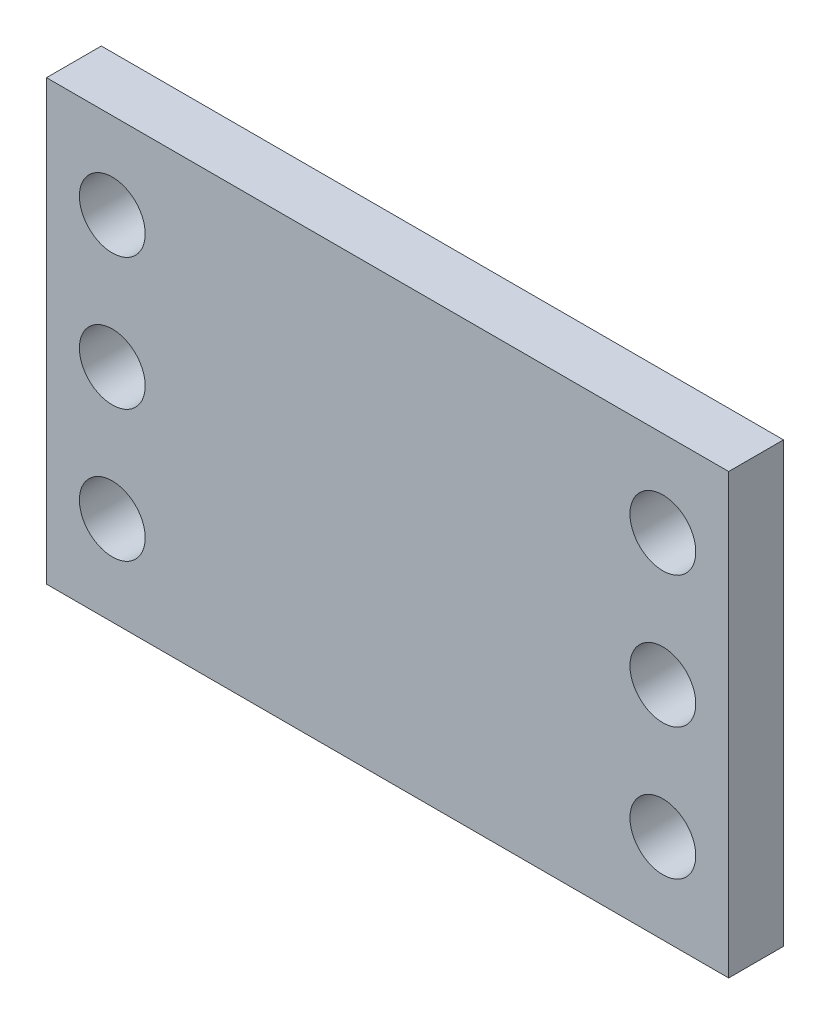
ISO-10303-21;
HEADER;
FILE_DESCRIPTION(('STEP AP214'),'2;1');
FILE_NAME('part.step','',(''),(''),'','','');
FILE_SCHEMA(('AUTOMOTIVE_DESIGN { 1 0 10303 214 1 1 1 1 }'));
ENDSEC;
DATA;
#1=APPLICATION_CONTEXT('core data for automotive mechanical design processes');
#2=APPLICATION_PROTOCOL_DEFINITION('international standard','automotive_design',2000,#1);
#3=PRODUCT_CONTEXT('',#1,'mechanical');
#4=PRODUCT('Part','Part','',(#3));
#5=PRODUCT_RELATED_PRODUCT_CATEGORY('part','',(#4));
#6=PRODUCT_DEFINITION_FORMATION('','',#4);
#7=PRODUCT_DEFINITION_CONTEXT('part definition',#1,'design');
#8=PRODUCT_DEFINITION('design','',#6,#7);
#9=PRODUCT_DEFINITION_SHAPE('','',#8);
#10=(LENGTH_UNIT() NAMED_UNIT(*) SI_UNIT(.MILLI.,.METRE.));
#11=(NAMED_UNIT(*) PLANE_ANGLE_UNIT() SI_UNIT($,.RADIAN.));
#12=(NAMED_UNIT(*) SI_UNIT($,.STERADIAN.) SOLID_ANGLE_UNIT());
#13=UNCERTAINTY_MEASURE_WITH_UNIT(LENGTH_MEASURE(1.E-05),#10,'distance_accuracy_value','');
#14=(GEOMETRIC_REPRESENTATION_CONTEXT(3) GLOBAL_UNCERTAINTY_ASSIGNED_CONTEXT((#13)) GLOBAL_UNIT_ASSIGNED_CONTEXT((#10,
#11,#12)) REPRESENTATION_CONTEXT('',''));
#15=CARTESIAN_POINT('',(0.,0.,0.));
#16=DIRECTION('',(0.,0.,1.));
#17=DIRECTION('',(1.,0.,0.));
#18=AXIS2_PLACEMENT_3D('',#15,#16,#17);
#19=CARTESIAN_POINT('',(37.9751232305072,19.2400028253771,5.));
#20=DIRECTION('',(1.,0.,0.));
#21=DIRECTION('',(0.,0.,-1.));
#22=AXIS2_PLACEMENT_3D('',#19,#20,#21);
#23=PLANE('',#22);
#24=DIRECTION('',(0.,-1.,0.));
#25=VECTOR('',#24,1.);
#26=CARTESIAN_POINT('',(37.9751232305072,19.2400028253771,0.));
#27=LINE('',#26,#25);
#28=CARTESIAN_POINT('',(37.9751232305072,59.2400028253771,0.));
#29=VERTEX_POINT('',#28);
#30=CARTESIAN_POINT('',(37.9751232305072,19.2400028253771,0.));
#31=VERTEX_POINT('',#30);
#32=EDGE_CURVE('E101',#29,#31,#27,.T.);
#33=ORIENTED_EDGE('',*,*,#32,.T.);
#34=DIRECTION('',(0.,0.,-1.));
#35=VECTOR('',#34,1.);
#36=CARTESIAN_POINT('',(37.9751232305072,19.2400028253771,5.));
#37=LINE('',#36,#35);
#38=CARTESIAN_POINT('',(37.9751232305072,19.2400028253771,5.));
#39=VERTEX_POINT('',#38);
#40=EDGE_CURVE('E11',#39,#31,#37,.T.);
#41=ORIENTED_EDGE('',*,*,#40,.F.);
#42=DIRECTION('',(0.,-1.,0.));
#43=VECTOR('',#42,1.);
#44=CARTESIAN_POINT('',(37.9751232305072,19.2400028253771,5.));
#45=LINE('',#44,#43);
#46=CARTESIAN_POINT('',(37.9751232305072,59.2400028253771,5.));
#47=VERTEX_POINT('',#46);
#48=EDGE_CURVE('E89',#47,#39,#45,.T.);
#49=ORIENTED_EDGE('',*,*,#48,.F.);
#50=DIRECTION('',(0.,0.,-1.));
#51=VECTOR('',#50,1.);
#52=CARTESIAN_POINT('',(37.9751232305072,59.2400028253771,5.));
#53=LINE('',#52,#51);
#54=EDGE_CURVE('E97',#47,#29,#53,.T.);
#55=ORIENTED_EDGE('',*,*,#54,.T.);
#56=EDGE_LOOP('',(#33,#41,#49,#55));
#57=FACE_BOUND('',#56,.T.);
#58=ADVANCED_FACE('F38',(#57),#23,.F.);
#59=CARTESIAN_POINT('',(37.9751232305072,19.2400028253771,5.));
#60=DIRECTION('',(0.,1.,0.));
#61=DIRECTION('',(0.,0.,1.));
#62=AXIS2_PLACEMENT_3D('',#59,#60,#61);
#63=PLANE('',#62);
#64=DIRECTION('',(1.,0.,0.));
#65=VECTOR('',#64,1.);
#66=CARTESIAN_POINT('',(37.9751232305072,19.2400028253771,0.));
#67=LINE('',#66,#65);
#68=CARTESIAN_POINT('',(100.181496793345,19.2400028253771,0.));
#69=VERTEX_POINT('',#68);
#70=EDGE_CURVE('E93',#31,#69,#67,.T.);
#71=ORIENTED_EDGE('',*,*,#70,.T.);
#72=DIRECTION('',(0.,0.,-1.));
#73=VECTOR('',#72,1.);
#74=CARTESIAN_POINT('',(100.181496793345,19.2400028253771,5.));
#75=LINE('',#74,#73);
#76=CARTESIAN_POINT('',(100.181496793345,19.2400028253771,5.));
#77=VERTEX_POINT('',#76);
#78=EDGE_CURVE('E46',#77,#69,#75,.T.);
#79=ORIENTED_EDGE('',*,*,#78,.F.);
#80=DIRECTION('',(1.,0.,0.));
#81=VECTOR('',#80,1.);
#82=CARTESIAN_POINT('',(37.9751232305072,19.2400028253771,5.));
#83=LINE('',#82,#81);
#84=EDGE_CURVE('E84',#39,#77,#83,.T.);
#85=ORIENTED_EDGE('',*,*,#84,.F.);
#86=ORIENTED_EDGE('',*,*,#40,.T.);
#87=EDGE_LOOP('',(#71,#79,#85,#86));
#88=FACE_BOUND('',#87,.T.);
#89=ADVANCED_FACE('F92',(#88),#63,.F.);
#90=CARTESIAN_POINT('',(100.181496793345,19.2400028253771,5.));
#91=DIRECTION('',(-1.,0.,0.));
#92=DIRECTION('',(0.,0.,1.));
#93=AXIS2_PLACEMENT_3D('',#90,#91,#92);
#94=PLANE('',#93);
#95=DIRECTION('',(0.,1.,0.));
#96=VECTOR('',#95,1.);
#97=CARTESIAN_POINT('',(100.181496793345,19.2400028253771,0.));
#98=LINE('',#97,#96);
#99=CARTESIAN_POINT('',(100.181496793345,59.2400028253771,0.));
#100=VERTEX_POINT('',#99);
#101=EDGE_CURVE('E71',#69,#100,#98,.T.);
#102=ORIENTED_EDGE('',*,*,#101,.T.);
#103=DIRECTION('',(0.,0.,-1.));
#104=VECTOR('',#103,1.);
#105=CARTESIAN_POINT('',(100.181496793345,59.2400028253771,5.));
#106=LINE('',#105,#104);
#107=CARTESIAN_POINT('',(100.181496793345,59.2400028253771,5.));
#108=VERTEX_POINT('',#107);
#109=EDGE_CURVE('E94',#108,#100,#106,.T.);
#110=ORIENTED_EDGE('',*,*,#109,.F.);
#111=DIRECTION('',(0.,1.,0.));
#112=VECTOR('',#111,1.);
#113=CARTESIAN_POINT('',(100.181496793345,19.2400028253771,5.));
#114=LINE('',#113,#112);
#115=EDGE_CURVE('E87',#77,#108,#114,.T.);
#116=ORIENTED_EDGE('',*,*,#115,.F.);
#117=ORIENTED_EDGE('',*,*,#78,.T.);
#118=EDGE_LOOP('',(#102,#110,#116,#117));
#119=FACE_BOUND('',#118,.T.);
#120=ADVANCED_FACE('F95',(#119),#94,.F.);
#121=CARTESIAN_POINT('',(37.9751232305072,59.2400028253771,5.));
#122=DIRECTION('',(0.,-1.,0.));
#123=DIRECTION('',(0.,0.,-1.));
#124=AXIS2_PLACEMENT_3D('',#121,#122,#123);
#125=PLANE('',#124);
#126=DIRECTION('',(-1.,0.,0.));
#127=VECTOR('',#126,1.);
#128=CARTESIAN_POINT('',(37.9751232305072,59.2400028253771,0.));
#129=LINE('',#128,#127);
#130=EDGE_CURVE('E77',#100,#29,#129,.T.);
#131=ORIENTED_EDGE('',*,*,#130,.T.);
#132=ORIENTED_EDGE('',*,*,#54,.F.);
#133=DIRECTION('',(-1.,0.,0.));
#134=VECTOR('',#133,1.);
#135=CARTESIAN_POINT('',(37.9751232305072,59.2400028253771,5.));
#136=LINE('',#135,#134);
#137=EDGE_CURVE('E54',#108,#47,#136,.T.);
#138=ORIENTED_EDGE('',*,*,#137,.F.);
#139=ORIENTED_EDGE('',*,*,#109,.T.);
#140=EDGE_LOOP('',(#131,#132,#138,#139));
#141=FACE_BOUND('',#140,.T.);
#142=ADVANCED_FACE('F109',(#141),#125,.F.);
#143=CARTESIAN_POINT('',(0.,0.,5.));
#144=DIRECTION('',(0.,0.,-1.));
#145=DIRECTION('',(-1.,0.,0.));
#146=AXIS2_PLACEMENT_3D('',#143,#144,#145);
#147=PLANE('',#146);
#148=CARTESIAN_POINT('',(94.1814967933452,39.3944343600588,5.));
#149=DIRECTION('',(0.,0.,-1.));
#150=DIRECTION('',(-1.,0.,0.));
#151=AXIS2_PLACEMENT_3D('',#148,#149,#150);
#152=CIRCLE('',#151,3.00000000000001);
#153=CARTESIAN_POINT('',(91.1814967933452,39.3944343600588,5.));
#154=VERTEX_POINT('',#153);
#155=EDGE_CURVE('E104',#154,#154,#152,.T.);
#156=ORIENTED_EDGE('',*,*,#155,.T.);
#157=EDGE_LOOP('',(#156));
#158=FACE_BOUND('',#157,.T.);
#159=CARTESIAN_POINT('',(94.1814967933452,51.3944343600588,5.));
#160=DIRECTION('',(0.,0.,-1.));
#161=DIRECTION('',(-1.,0.,0.));
#162=AXIS2_PLACEMENT_3D('',#159,#160,#161);
#163=CIRCLE('',#162,3.00000000000001);
#164=CARTESIAN_POINT('',(91.1814967933452,51.3944343600588,5.));
#165=VERTEX_POINT('',#164);
#166=EDGE_CURVE('E117',#165,#165,#163,.T.);
#167=ORIENTED_EDGE('',*,*,#166,.T.);
#168=EDGE_LOOP('',(#167));
#169=FACE_BOUND('',#168,.T.);
#170=CARTESIAN_POINT('',(43.975123230507,27.3944343600588,5.));
#171=DIRECTION('',(0.,0.,-1.));
#172=DIRECTION('',(-1.,0.,0.));
#173=AXIS2_PLACEMENT_3D('',#170,#171,#172);
#174=CIRCLE('',#173,3.);
#175=CARTESIAN_POINT('',(40.975123230507,27.3944343600588,5.));
#176=VERTEX_POINT('',#175);
#177=EDGE_CURVE('E120',#176,#176,#174,.T.);
#178=ORIENTED_EDGE('',*,*,#177,.T.);
#179=EDGE_LOOP('',(#178));
#180=FACE_BOUND('',#179,.T.);
#181=CARTESIAN_POINT('',(43.975123230507,39.3944343600588,5.));
#182=DIRECTION('',(0.,0.,-1.));
#183=DIRECTION('',(-1.,0.,0.));
#184=AXIS2_PLACEMENT_3D('',#181,#182,#183);
#185=CIRCLE('',#184,3.);
#186=CARTESIAN_POINT('',(40.975123230507,39.3944343600588,5.));
#187=VERTEX_POINT('',#186);
#188=EDGE_CURVE('E123',#187,#187,#185,.T.);
#189=ORIENTED_EDGE('',*,*,#188,.T.);
#190=EDGE_LOOP('',(#189));
#191=FACE_BOUND('',#190,.T.);
#192=CARTESIAN_POINT('',(43.975123230507,51.3944343600588,5.));
#193=DIRECTION('',(0.,0.,-1.));
#194=DIRECTION('',(-1.,0.,0.));
#195=AXIS2_PLACEMENT_3D('',#192,#193,#194);
#196=CIRCLE('',#195,3.);
#197=CARTESIAN_POINT('',(40.975123230507,51.3944343600588,5.));
#198=VERTEX_POINT('',#197);
#199=EDGE_CURVE('E126',#198,#198,#196,.T.);
#200=ORIENTED_EDGE('',*,*,#199,.T.);
#201=EDGE_LOOP('',(#200));
#202=FACE_BOUND('',#201,.T.);
#203=CARTESIAN_POINT('',(94.1814967933452,27.3944343600588,5.));
#204=DIRECTION('',(0.,0.,-1.));
#205=DIRECTION('',(-1.,0.,0.));
#206=AXIS2_PLACEMENT_3D('',#203,#204,#205);
#207=CIRCLE('',#206,2.99999999999999);
#208=CARTESIAN_POINT('',(91.1814967933452,27.3944343600588,5.));
#209=VERTEX_POINT('',#208);
#210=EDGE_CURVE('E129',#209,#209,#207,.T.);
#211=ORIENTED_EDGE('',*,*,#210,.T.);
#212=EDGE_LOOP('',(#211));
#213=FACE_BOUND('',#212,.T.);
#214=ORIENTED_EDGE('',*,*,#48,.T.);
#215=ORIENTED_EDGE('',*,*,#84,.T.);
#216=ORIENTED_EDGE('',*,*,#115,.T.);
#217=ORIENTED_EDGE('',*,*,#137,.T.);
#218=EDGE_LOOP('',(#214,#215,#216,#217));
#219=FACE_BOUND('',#218,.T.);
#220=ADVANCED_FACE('F85',(#158,#169,#180,#191,#202,#213,#219),#147,.F.);
#221=CARTESIAN_POINT('',(0.,0.,0.));
#222=DIRECTION('',(0.,0.,-1.));
#223=DIRECTION('',(-1.,0.,0.));
#224=AXIS2_PLACEMENT_3D('',#221,#222,#223);
#225=PLANE('',#224);
#226=CARTESIAN_POINT('',(94.1814967933452,39.3944343600588,0.));
#227=DIRECTION('',(0.,0.,-1.));
#228=DIRECTION('',(-1.,0.,0.));
#229=AXIS2_PLACEMENT_3D('',#226,#227,#228);
#230=CIRCLE('',#229,3.00000000000001);
#231=CARTESIAN_POINT('',(91.1814967933452,39.3944343600588,0.));
#232=VERTEX_POINT('',#231);
#233=EDGE_CURVE('E135',#232,#232,#230,.T.);
#234=ORIENTED_EDGE('',*,*,#233,.F.);
#235=EDGE_LOOP('',(#234));
#236=FACE_BOUND('',#235,.T.);
#237=CARTESIAN_POINT('',(94.1814967933452,51.3944343600588,0.));
#238=DIRECTION('',(0.,0.,-1.));
#239=DIRECTION('',(-1.,0.,0.));
#240=AXIS2_PLACEMENT_3D('',#237,#238,#239);
#241=CIRCLE('',#240,3.00000000000001);
#242=CARTESIAN_POINT('',(91.1814967933452,51.3944343600588,0.));
#243=VERTEX_POINT('',#242);
#244=EDGE_CURVE('E143',#243,#243,#241,.T.);
#245=ORIENTED_EDGE('',*,*,#244,.F.);
#246=EDGE_LOOP('',(#245));
#247=FACE_BOUND('',#246,.T.);
#248=CARTESIAN_POINT('',(43.975123230507,27.3944343600588,0.));
#249=DIRECTION('',(0.,0.,-1.));
#250=DIRECTION('',(-1.,0.,0.));
#251=AXIS2_PLACEMENT_3D('',#248,#249,#250);
#252=CIRCLE('',#251,3.);
#253=CARTESIAN_POINT('',(40.975123230507,27.3944343600588,0.));
#254=VERTEX_POINT('',#253);
#255=EDGE_CURVE('E139',#254,#254,#252,.T.);
#256=ORIENTED_EDGE('',*,*,#255,.F.);
#257=EDGE_LOOP('',(#256));
#258=FACE_BOUND('',#257,.T.);
#259=CARTESIAN_POINT('',(43.975123230507,39.3944343600588,0.));
#260=DIRECTION('',(0.,0.,-1.));
#261=DIRECTION('',(-1.,0.,0.));
#262=AXIS2_PLACEMENT_3D('',#259,#260,#261);
#263=CIRCLE('',#262,3.);
#264=CARTESIAN_POINT('',(40.975123230507,39.3944343600588,0.));
#265=VERTEX_POINT('',#264);
#266=EDGE_CURVE('E136',#265,#265,#263,.T.);
#267=ORIENTED_EDGE('',*,*,#266,.F.);
#268=EDGE_LOOP('',(#267));
#269=FACE_BOUND('',#268,.T.);
#270=CARTESIAN_POINT('',(43.975123230507,51.3944343600588,0.));
#271=DIRECTION('',(0.,0.,-1.));
#272=DIRECTION('',(-1.,0.,0.));
#273=AXIS2_PLACEMENT_3D('',#270,#271,#272);
#274=CIRCLE('',#273,3.);
#275=CARTESIAN_POINT('',(40.975123230507,51.3944343600588,0.));
#276=VERTEX_POINT('',#275);
#277=EDGE_CURVE('E140',#276,#276,#274,.T.);
#278=ORIENTED_EDGE('',*,*,#277,.F.);
#279=EDGE_LOOP('',(#278));
#280=FACE_BOUND('',#279,.T.);
#281=CARTESIAN_POINT('',(94.1814967933452,27.3944343600588,0.));
#282=DIRECTION('',(0.,0.,-1.));
#283=DIRECTION('',(-1.,0.,0.));
#284=AXIS2_PLACEMENT_3D('',#281,#282,#283);
#285=CIRCLE('',#284,2.99999999999999);
#286=CARTESIAN_POINT('',(91.1814967933452,27.3944343600588,0.));
#287=VERTEX_POINT('',#286);
#288=EDGE_CURVE('E132',#287,#287,#285,.T.);
#289=ORIENTED_EDGE('',*,*,#288,.F.);
#290=EDGE_LOOP('',(#289));
#291=FACE_BOUND('',#290,.T.);
#292=ORIENTED_EDGE('',*,*,#32,.F.);
#293=ORIENTED_EDGE('',*,*,#130,.F.);
#294=ORIENTED_EDGE('',*,*,#101,.F.);
#295=ORIENTED_EDGE('',*,*,#70,.F.);
#296=EDGE_LOOP('',(#292,#293,#294,#295));
#297=FACE_BOUND('',#296,.T.);
#298=ADVANCED_FACE('F112',(#236,#247,#258,#269,#280,#291,#297),#225,.T.);
#299=CARTESIAN_POINT('',(94.1814967933452,27.3944343600588,10.));
#300=DIRECTION('',(0.,0.,-1.));
#301=DIRECTION('',(-1.,0.,0.));
#302=AXIS2_PLACEMENT_3D('',#299,#300,#301);
#303=CYLINDRICAL_SURFACE('',#302,2.99999999999999);
#304=ORIENTED_EDGE('',*,*,#288,.T.);
#305=EDGE_LOOP('',(#304));
#306=FACE_BOUND('',#305,.T.);
#307=ORIENTED_EDGE('',*,*,#210,.F.);
#308=EDGE_LOOP('',(#307));
#309=FACE_BOUND('',#308,.T.);
#310=ADVANCED_FACE('F156',(#306,#309),#303,.F.);
#311=CARTESIAN_POINT('',(43.975123230507,51.3944343600588,10.));
#312=DIRECTION('',(0.,0.,-1.));
#313=DIRECTION('',(-1.,0.,0.));
#314=AXIS2_PLACEMENT_3D('',#311,#312,#313);
#315=CYLINDRICAL_SURFACE('',#314,3.);
#316=ORIENTED_EDGE('',*,*,#277,.T.);
#317=EDGE_LOOP('',(#316));
#318=FACE_BOUND('',#317,.T.);
#319=ORIENTED_EDGE('',*,*,#199,.F.);
#320=EDGE_LOOP('',(#319));
#321=FACE_BOUND('',#320,.T.);
#322=ADVANCED_FACE('F151',(#318,#321),#315,.F.);
#323=CARTESIAN_POINT('',(43.975123230507,39.3944343600588,10.));
#324=DIRECTION('',(0.,0.,-1.));
#325=DIRECTION('',(-1.,0.,0.));
#326=AXIS2_PLACEMENT_3D('',#323,#324,#325);
#327=CYLINDRICAL_SURFACE('',#326,3.);
#328=ORIENTED_EDGE('',*,*,#266,.T.);
#329=EDGE_LOOP('',(#328));
#330=FACE_BOUND('',#329,.T.);
#331=ORIENTED_EDGE('',*,*,#188,.F.);
#332=EDGE_LOOP('',(#331));
#333=FACE_BOUND('',#332,.T.);
#334=ADVANCED_FACE('F217',(#330,#333),#327,.F.);
#335=CARTESIAN_POINT('',(43.975123230507,27.3944343600588,10.));
#336=DIRECTION('',(0.,0.,-1.));
#337=DIRECTION('',(-1.,0.,0.));
#338=AXIS2_PLACEMENT_3D('',#335,#336,#337);
#339=CYLINDRICAL_SURFACE('',#338,3.);
#340=ORIENTED_EDGE('',*,*,#255,.T.);
#341=EDGE_LOOP('',(#340));
#342=FACE_BOUND('',#341,.T.);
#343=ORIENTED_EDGE('',*,*,#177,.F.);
#344=EDGE_LOOP('',(#343));
#345=FACE_BOUND('',#344,.T.);
#346=ADVANCED_FACE('F227',(#342,#345),#339,.F.);
#347=CARTESIAN_POINT('',(94.1814967933452,51.3944343600588,10.));
#348=DIRECTION('',(0.,0.,-1.));
#349=DIRECTION('',(-1.,0.,0.));
#350=AXIS2_PLACEMENT_3D('',#347,#348,#349);
#351=CYLINDRICAL_SURFACE('',#350,3.00000000000001);
#352=ORIENTED_EDGE('',*,*,#244,.T.);
#353=EDGE_LOOP('',(#352));
#354=FACE_BOUND('',#353,.T.);
#355=ORIENTED_EDGE('',*,*,#166,.F.);
#356=EDGE_LOOP('',(#355));
#357=FACE_BOUND('',#356,.T.);
#358=ADVANCED_FACE('F238',(#354,#357),#351,.F.);
#359=CARTESIAN_POINT('',(94.1814967933452,39.3944343600588,10.));
#360=DIRECTION('',(0.,0.,-1.));
#361=DIRECTION('',(-1.,0.,0.));
#362=AXIS2_PLACEMENT_3D('',#359,#360,#361);
#363=CYLINDRICAL_SURFACE('',#362,3.00000000000001);
#364=ORIENTED_EDGE('',*,*,#233,.T.);
#365=EDGE_LOOP('',(#364));
#366=FACE_BOUND('',#365,.T.);
#367=ORIENTED_EDGE('',*,*,#155,.F.);
#368=EDGE_LOOP('',(#367));
#369=FACE_BOUND('',#368,.T.);
#370=ADVANCED_FACE('F249',(#366,#369),#363,.F.);
#371=CLOSED_SHELL('',(#58,#89,#120,#142,#220,#298,#310,#322,#334,#346,#358,#370));
#372=MANIFOLD_SOLID_BREP('B2',#371);
#373=ADVANCED_BREP_SHAPE_REPRESENTATION('',(#18,#372),#14);
#374=SHAPE_DEFINITION_REPRESENTATION(#9,#373);
ENDSEC;
END-ISO-10303-21;
